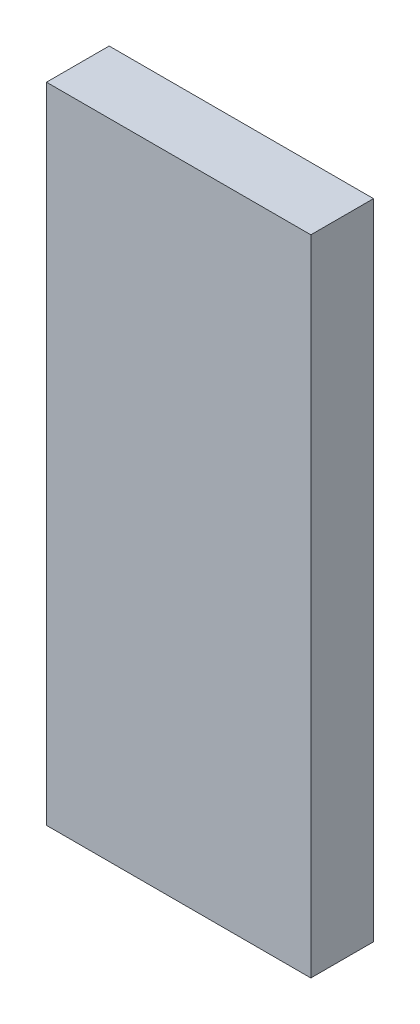
ISO-10303-21;
HEADER;
FILE_DESCRIPTION(('STEP AP214'),'2;1');
FILE_NAME('part.step','',(''),(''),'','','');
FILE_SCHEMA(('AUTOMOTIVE_DESIGN { 1 0 10303 214 1 1 1 1 }'));
ENDSEC;
DATA;
#1=APPLICATION_CONTEXT('core data for automotive mechanical design processes');
#2=APPLICATION_PROTOCOL_DEFINITION('international standard','automotive_design',2000,#1);
#3=PRODUCT_CONTEXT('',#1,'mechanical');
#4=PRODUCT('Part','Part','',(#3));
#5=PRODUCT_RELATED_PRODUCT_CATEGORY('part','',(#4));
#6=PRODUCT_DEFINITION_FORMATION('','',#4);
#7=PRODUCT_DEFINITION_CONTEXT('part definition',#1,'design');
#8=PRODUCT_DEFINITION('design','',#6,#7);
#9=PRODUCT_DEFINITION_SHAPE('','',#8);
#10=(LENGTH_UNIT() NAMED_UNIT(*) SI_UNIT(.MILLI.,.METRE.));
#11=(NAMED_UNIT(*) PLANE_ANGLE_UNIT() SI_UNIT($,.RADIAN.));
#12=(NAMED_UNIT(*) SI_UNIT($,.STERADIAN.) SOLID_ANGLE_UNIT());
#13=UNCERTAINTY_MEASURE_WITH_UNIT(LENGTH_MEASURE(1.E-05),#10,'distance_accuracy_value','');
#14=(GEOMETRIC_REPRESENTATION_CONTEXT(3) GLOBAL_UNCERTAINTY_ASSIGNED_CONTEXT((#13)) GLOBAL_UNIT_ASSIGNED_CONTEXT((#10,
#11,#12)) REPRESENTATION_CONTEXT('',''));
#15=CARTESIAN_POINT('',(0.,0.,0.));
#16=DIRECTION('',(0.,0.,1.));
#17=DIRECTION('',(1.,0.,0.));
#18=AXIS2_PLACEMENT_3D('',#15,#16,#17);
#19=CARTESIAN_POINT('',(0.67499992,-1.643507,0.));
#20=DIRECTION('',(-1.,0.,0.));
#21=DIRECTION('',(0.,1.,0.));
#22=AXIS2_PLACEMENT_3D('',#19,#20,#21);
#23=PLANE('',#22);
#24=DIRECTION('',(0.,1.,0.));
#25=VECTOR('',#24,1.);
#26=CARTESIAN_POINT('',(0.67499992,-1.643507,0.));
#27=LINE('',#26,#25);
#28=CARTESIAN_POINT('',(0.67499992,-1.643507,0.));
#29=VERTEX_POINT('',#28);
#30=CARTESIAN_POINT('',(0.67499992,1.64350954,0.));
#31=VERTEX_POINT('',#30);
#32=EDGE_CURVE('E11',#29,#31,#27,.T.);
#33=ORIENTED_EDGE('',*,*,#32,.T.);
#34=DIRECTION('',(0.,0.,1.));
#35=VECTOR('',#34,1.);
#36=CARTESIAN_POINT('',(0.67499992,1.64350954,0.));
#37=LINE('',#36,#35);
#38=CARTESIAN_POINT('',(0.67499992,1.64350954,0.3200019));
#39=VERTEX_POINT('',#38);
#40=EDGE_CURVE('E24',#31,#39,#37,.T.);
#41=ORIENTED_EDGE('',*,*,#40,.T.);
#42=DIRECTION('',(0.,1.,0.));
#43=VECTOR('',#42,1.);
#44=CARTESIAN_POINT('',(0.67499992,-1.643507,0.3200019));
#45=LINE('',#44,#43);
#46=CARTESIAN_POINT('',(0.67499992,-1.643507,0.3200019));
#47=VERTEX_POINT('',#46);
#48=EDGE_CURVE('E87',#47,#39,#45,.T.);
#49=ORIENTED_EDGE('',*,*,#48,.F.);
#50=DIRECTION('',(0.,0.,1.));
#51=VECTOR('',#50,1.);
#52=CARTESIAN_POINT('',(0.67499992,-1.643507,0.));
#53=LINE('',#52,#51);
#54=EDGE_CURVE('E36',#29,#47,#53,.T.);
#55=ORIENTED_EDGE('',*,*,#54,.F.);
#56=EDGE_LOOP('',(#33,#41,#49,#55));
#57=FACE_BOUND('',#56,.T.);
#58=ADVANCED_FACE('F17',(#57),#23,.F.);
#59=CARTESIAN_POINT('',(0.67499992,1.64350954,0.));
#60=DIRECTION('',(0.,-1.,0.));
#61=DIRECTION('',(-1.,0.,0.));
#62=AXIS2_PLACEMENT_3D('',#59,#60,#61);
#63=PLANE('',#62);
#64=DIRECTION('',(-1.,0.,0.));
#65=VECTOR('',#64,1.);
#66=CARTESIAN_POINT('',(0.67499992,1.64350954,0.));
#67=LINE('',#66,#65);
#68=CARTESIAN_POINT('',(-0.67499992,1.64350954,0.));
#69=VERTEX_POINT('',#68);
#70=EDGE_CURVE('E84',#31,#69,#67,.T.);
#71=ORIENTED_EDGE('',*,*,#70,.T.);
#72=DIRECTION('',(0.,0.,1.));
#73=VECTOR('',#72,1.);
#74=CARTESIAN_POINT('',(-0.67499992,1.64350954,0.));
#75=LINE('',#74,#73);
#76=CARTESIAN_POINT('',(-0.67499992,1.64350954,0.3200019));
#77=VERTEX_POINT('',#76);
#78=EDGE_CURVE('E82',#69,#77,#75,.T.);
#79=ORIENTED_EDGE('',*,*,#78,.T.);
#80=DIRECTION('',(-1.,0.,0.));
#81=VECTOR('',#80,1.);
#82=CARTESIAN_POINT('',(0.67499992,1.64350954,0.3200019));
#83=LINE('',#82,#81);
#84=EDGE_CURVE('E62',#39,#77,#83,.T.);
#85=ORIENTED_EDGE('',*,*,#84,.F.);
#86=ORIENTED_EDGE('',*,*,#40,.F.);
#87=EDGE_LOOP('',(#71,#79,#85,#86));
#88=FACE_BOUND('',#87,.T.);
#89=ADVANCED_FACE('F89',(#88),#63,.F.);
#90=CARTESIAN_POINT('',(-0.67499992,1.64350954,0.));
#91=DIRECTION('',(1.,0.,0.));
#92=DIRECTION('',(0.,-1.,0.));
#93=AXIS2_PLACEMENT_3D('',#90,#91,#92);
#94=PLANE('',#93);
#95=DIRECTION('',(0.,-1.,0.));
#96=VECTOR('',#95,1.);
#97=CARTESIAN_POINT('',(-0.67499992,1.64350954,0.));
#98=LINE('',#97,#96);
#99=CARTESIAN_POINT('',(-0.67499992,-1.643507,0.));
#100=VERTEX_POINT('',#99);
#101=EDGE_CURVE('E71',#69,#100,#98,.T.);
#102=ORIENTED_EDGE('',*,*,#101,.T.);
#103=DIRECTION('',(0.,0.,1.));
#104=VECTOR('',#103,1.);
#105=CARTESIAN_POINT('',(-0.67499992,-1.643507,0.));
#106=LINE('',#105,#104);
#107=CARTESIAN_POINT('',(-0.67499992,-1.643507,0.3200019));
#108=VERTEX_POINT('',#107);
#109=EDGE_CURVE('E65',#100,#108,#106,.T.);
#110=ORIENTED_EDGE('',*,*,#109,.T.);
#111=DIRECTION('',(0.,-1.,0.));
#112=VECTOR('',#111,1.);
#113=CARTESIAN_POINT('',(-0.67499992,1.64350954,0.3200019));
#114=LINE('',#113,#112);
#115=EDGE_CURVE('E57',#77,#108,#114,.T.);
#116=ORIENTED_EDGE('',*,*,#115,.F.);
#117=ORIENTED_EDGE('',*,*,#78,.F.);
#118=EDGE_LOOP('',(#102,#110,#116,#117));
#119=FACE_BOUND('',#118,.T.);
#120=ADVANCED_FACE('F69',(#119),#94,.F.);
#121=CARTESIAN_POINT('',(-0.67499992,-1.643507,0.));
#122=DIRECTION('',(0.,1.,0.));
#123=DIRECTION('',(1.,0.,0.));
#124=AXIS2_PLACEMENT_3D('',#121,#122,#123);
#125=PLANE('',#124);
#126=DIRECTION('',(1.,0.,0.));
#127=VECTOR('',#126,1.);
#128=CARTESIAN_POINT('',(-0.67499992,-1.643507,0.));
#129=LINE('',#128,#127);
#130=EDGE_CURVE('E66',#100,#29,#129,.T.);
#131=ORIENTED_EDGE('',*,*,#130,.T.);
#132=ORIENTED_EDGE('',*,*,#54,.T.);
#133=DIRECTION('',(1.,0.,0.));
#134=VECTOR('',#133,1.);
#135=CARTESIAN_POINT('',(-0.67499992,-1.643507,0.3200019));
#136=LINE('',#135,#134);
#137=EDGE_CURVE('E61',#108,#47,#136,.T.);
#138=ORIENTED_EDGE('',*,*,#137,.F.);
#139=ORIENTED_EDGE('',*,*,#109,.F.);
#140=EDGE_LOOP('',(#131,#132,#138,#139));
#141=FACE_BOUND('',#140,.T.);
#142=ADVANCED_FACE('F76',(#141),#125,.F.);
#143=CARTESIAN_POINT('',(0.,1.269999998412E-06,0.));
#144=DIRECTION('',(0.,0.,1.));
#145=DIRECTION('',(1.,0.,0.));
#146=AXIS2_PLACEMENT_3D('',#143,#144,#145);
#147=PLANE('',#146);
#148=ORIENTED_EDGE('',*,*,#130,.F.);
#149=ORIENTED_EDGE('',*,*,#101,.F.);
#150=ORIENTED_EDGE('',*,*,#70,.F.);
#151=ORIENTED_EDGE('',*,*,#32,.F.);
#152=EDGE_LOOP('',(#148,#149,#150,#151));
#153=FACE_BOUND('',#152,.T.);
#154=ADVANCED_FACE('F91',(#153),#147,.F.);
#155=CARTESIAN_POINT('',(0.,1.269999998412E-06,0.3200019));
#156=DIRECTION('',(0.,0.,1.));
#157=DIRECTION('',(1.,0.,0.));
#158=AXIS2_PLACEMENT_3D('',#155,#156,#157);
#159=PLANE('',#158);
#160=ORIENTED_EDGE('',*,*,#48,.T.);
#161=ORIENTED_EDGE('',*,*,#84,.T.);
#162=ORIENTED_EDGE('',*,*,#115,.T.);
#163=ORIENTED_EDGE('',*,*,#137,.T.);
#164=EDGE_LOOP('',(#160,#161,#162,#163));
#165=FACE_BOUND('',#164,.T.);
#166=ADVANCED_FACE('F59',(#165),#159,.T.);
#167=CLOSED_SHELL('',(#58,#89,#120,#142,#154,#166));
#168=MANIFOLD_SOLID_BREP('B1',#167);
#169=ADVANCED_BREP_SHAPE_REPRESENTATION('',(#18,#168),#14);
#170=SHAPE_DEFINITION_REPRESENTATION(#9,#169);
ENDSEC;
END-ISO-10303-21;
